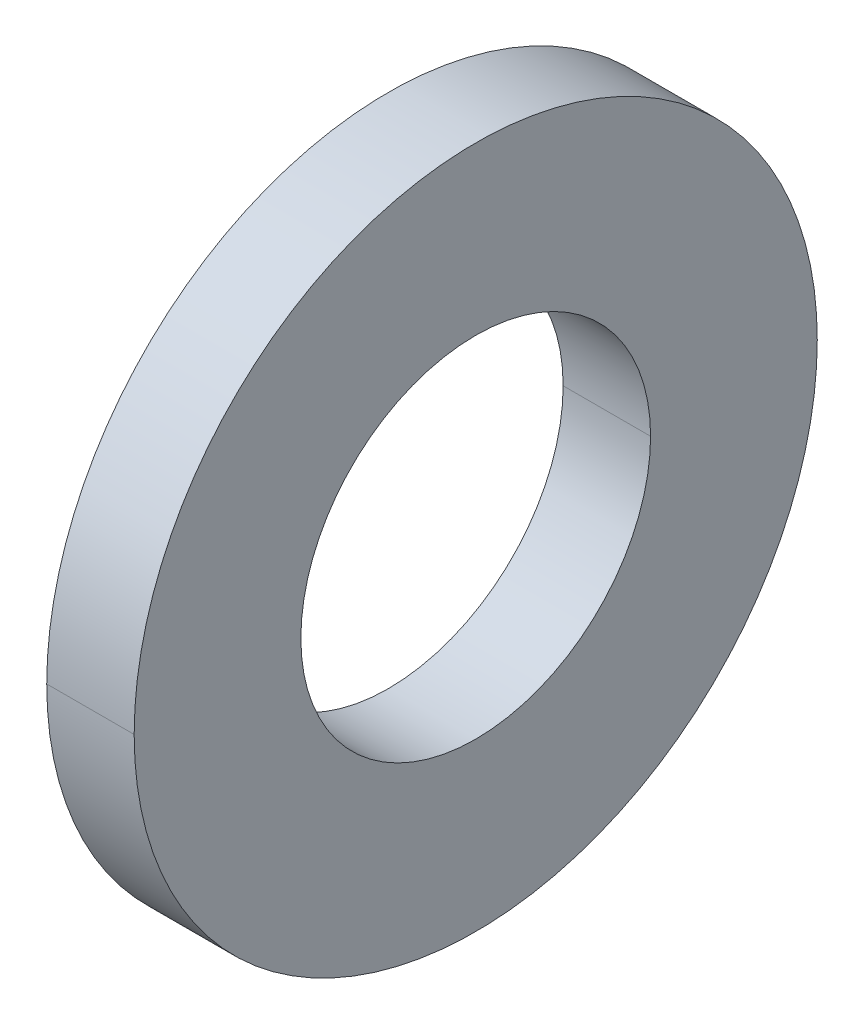
ISO-10303-21;
HEADER;
FILE_DESCRIPTION(('STEP AP214'),'2;1');
FILE_NAME('part.step','',(''),(''),'','','');
FILE_SCHEMA(('AUTOMOTIVE_DESIGN { 1 0 10303 214 1 1 1 1 }'));
ENDSEC;
DATA;
#1=APPLICATION_CONTEXT('core data for automotive mechanical design processes');
#2=APPLICATION_PROTOCOL_DEFINITION('international standard','automotive_design',2000,#1);
#3=PRODUCT_CONTEXT('',#1,'mechanical');
#4=PRODUCT('Part','Part','',(#3));
#5=PRODUCT_RELATED_PRODUCT_CATEGORY('part','',(#4));
#6=PRODUCT_DEFINITION_FORMATION('','',#4);
#7=PRODUCT_DEFINITION_CONTEXT('part definition',#1,'design');
#8=PRODUCT_DEFINITION('design','',#6,#7);
#9=PRODUCT_DEFINITION_SHAPE('','',#8);
#10=(LENGTH_UNIT() NAMED_UNIT(*) SI_UNIT(.MILLI.,.METRE.));
#11=(NAMED_UNIT(*) PLANE_ANGLE_UNIT() SI_UNIT($,.RADIAN.));
#12=(NAMED_UNIT(*) SI_UNIT($,.STERADIAN.) SOLID_ANGLE_UNIT());
#13=UNCERTAINTY_MEASURE_WITH_UNIT(LENGTH_MEASURE(1.E-05),#10,'distance_accuracy_value','');
#14=(GEOMETRIC_REPRESENTATION_CONTEXT(3) GLOBAL_UNCERTAINTY_ASSIGNED_CONTEXT((#13)) GLOBAL_UNIT_ASSIGNED_CONTEXT((#10,
#11,#12)) REPRESENTATION_CONTEXT('',''));
#15=CARTESIAN_POINT('',(0.,0.,0.));
#16=DIRECTION('',(0.,0.,1.));
#17=DIRECTION('',(1.,0.,0.));
#18=AXIS2_PLACEMENT_3D('',#15,#16,#17);
#19=CARTESIAN_POINT('',(0.8,0.,0.));
#20=DIRECTION('',(-1.,0.,0.));
#21=DIRECTION('',(0.,1.,0.));
#22=AXIS2_PLACEMENT_3D('',#19,#20,#21);
#23=CYLINDRICAL_SURFACE('',#22,6.25);
#24=CARTESIAN_POINT('',(-0.8,0.,0.));
#25=DIRECTION('',(1.,0.,0.));
#26=DIRECTION('',(0.,0.,-1.));
#27=AXIS2_PLACEMENT_3D('',#24,#25,#26);
#28=CIRCLE('',#27,6.25);
#29=CARTESIAN_POINT('',(-0.8,0.,6.25));
#30=VERTEX_POINT('',#29);
#31=CARTESIAN_POINT('',(-0.8,0.,-6.25));
#32=VERTEX_POINT('',#31);
#33=EDGE_CURVE('E10',#30,#32,#28,.T.);
#34=ORIENTED_EDGE('',*,*,#33,.T.);
#35=CARTESIAN_POINT('',(0.8,0.,-6.25));
#36=DIRECTION('',(-1.,0.,0.));
#37=VECTOR('',#36,1.);
#38=LINE('',#35,#37);
#39=CARTESIAN_POINT('',(0.8,0.,-6.25));
#40=VERTEX_POINT('',#39);
#41=EDGE_CURVE('E25',#40,#32,#38,.T.);
#42=ORIENTED_EDGE('',*,*,#41,.F.);
#43=CARTESIAN_POINT('',(0.8,0.,0.));
#44=DIRECTION('',(1.,0.,0.));
#45=DIRECTION('',(0.,0.,-1.));
#46=AXIS2_PLACEMENT_3D('',#43,#44,#45);
#47=CIRCLE('',#46,6.25);
#48=CARTESIAN_POINT('',(0.8,0.,6.25));
#49=VERTEX_POINT('',#48);
#50=EDGE_CURVE('E160',#49,#40,#47,.T.);
#51=ORIENTED_EDGE('',*,*,#50,.F.);
#52=CARTESIAN_POINT('',(0.8,0.,6.25));
#53=DIRECTION('',(-1.,0.,0.));
#54=VECTOR('',#53,1.);
#55=LINE('',#52,#54);
#56=EDGE_CURVE('E148',#49,#30,#55,.T.);
#57=ORIENTED_EDGE('',*,*,#56,.T.);
#58=EDGE_LOOP('',(#34,#42,#51,#57));
#59=FACE_BOUND('',#58,.T.);
#60=ADVANCED_FACE('F16',(#59),#23,.T.);
#61=CARTESIAN_POINT('',(0.8,0.,0.));
#62=DIRECTION('',(-1.,0.,0.));
#63=DIRECTION('',(0.,-1.,0.));
#64=AXIS2_PLACEMENT_3D('',#61,#62,#63);
#65=CYLINDRICAL_SURFACE('',#64,6.25);
#66=CARTESIAN_POINT('',(0.8,0.,0.));
#67=DIRECTION('',(1.,0.,0.));
#68=DIRECTION('',(0.,0.,-1.));
#69=AXIS2_PLACEMENT_3D('',#66,#67,#68);
#70=CIRCLE('',#69,6.25);
#71=EDGE_CURVE('E145',#40,#49,#70,.T.);
#72=ORIENTED_EDGE('',*,*,#71,.F.);
#73=ORIENTED_EDGE('',*,*,#41,.T.);
#74=CARTESIAN_POINT('',(-0.8,0.,0.));
#75=DIRECTION('',(1.,0.,0.));
#76=DIRECTION('',(0.,0.,-1.));
#77=AXIS2_PLACEMENT_3D('',#74,#75,#76);
#78=CIRCLE('',#77,6.25);
#79=EDGE_CURVE('E113',#32,#30,#78,.T.);
#80=ORIENTED_EDGE('',*,*,#79,.T.);
#81=ORIENTED_EDGE('',*,*,#56,.F.);
#82=EDGE_LOOP('',(#72,#73,#80,#81));
#83=FACE_BOUND('',#82,.T.);
#84=ADVANCED_FACE('F121',(#83),#65,.T.);
#85=CARTESIAN_POINT('',(-0.8,6.25,0.));
#86=DIRECTION('',(-1.,0.,0.));
#87=DIRECTION('',(0.,0.,1.));
#88=AXIS2_PLACEMENT_3D('',#85,#86,#87);
#89=PLANE('',#88);
#90=CARTESIAN_POINT('',(-0.8,0.,0.));
#91=DIRECTION('',(1.,0.,0.));
#92=DIRECTION('',(0.,0.,-1.));
#93=AXIS2_PLACEMENT_3D('',#90,#91,#92);
#94=CIRCLE('',#93,3.2);
#95=CARTESIAN_POINT('',(-0.8,0.,-3.2));
#96=VERTEX_POINT('',#95);
#97=CARTESIAN_POINT('',(-0.8,0.,3.2));
#98=VERTEX_POINT('',#97);
#99=EDGE_CURVE('E72',#96,#98,#94,.T.);
#100=ORIENTED_EDGE('',*,*,#99,.T.);
#101=CARTESIAN_POINT('',(-0.8,0.,0.));
#102=DIRECTION('',(1.,0.,0.));
#103=DIRECTION('',(0.,0.,-1.));
#104=AXIS2_PLACEMENT_3D('',#101,#102,#103);
#105=CIRCLE('',#104,3.2);
#106=EDGE_CURVE('E108',#98,#96,#105,.T.);
#107=ORIENTED_EDGE('',*,*,#106,.T.);
#108=EDGE_LOOP('',(#100,#107));
#109=FACE_BOUND('',#108,.T.);
#110=ORIENTED_EDGE('',*,*,#79,.F.);
#111=ORIENTED_EDGE('',*,*,#33,.F.);
#112=EDGE_LOOP('',(#110,#111));
#113=FACE_BOUND('',#112,.T.);
#114=ADVANCED_FACE('F93',(#109,#113),#89,.T.);
#115=CARTESIAN_POINT('',(0.8,0.,0.));
#116=DIRECTION('',(-1.,0.,0.));
#117=DIRECTION('',(0.,1.,0.));
#118=AXIS2_PLACEMENT_3D('',#115,#116,#117);
#119=CYLINDRICAL_SURFACE('',#118,3.2);
#120=ORIENTED_EDGE('',*,*,#106,.F.);
#121=CARTESIAN_POINT('',(0.8,0.,3.2));
#122=DIRECTION('',(-1.,0.,0.));
#123=VECTOR('',#122,1.);
#124=LINE('',#121,#123);
#125=CARTESIAN_POINT('',(0.8,0.,3.2));
#126=VERTEX_POINT('',#125);
#127=EDGE_CURVE('E62',#126,#98,#124,.T.);
#128=ORIENTED_EDGE('',*,*,#127,.F.);
#129=CARTESIAN_POINT('',(0.8,0.,0.));
#130=DIRECTION('',(1.,0.,0.));
#131=DIRECTION('',(0.,0.,-1.));
#132=AXIS2_PLACEMENT_3D('',#129,#130,#131);
#133=CIRCLE('',#132,3.2);
#134=CARTESIAN_POINT('',(0.8,0.,-3.2));
#135=VERTEX_POINT('',#134);
#136=EDGE_CURVE('E54',#126,#135,#133,.T.);
#137=ORIENTED_EDGE('',*,*,#136,.T.);
#138=CARTESIAN_POINT('',(0.8,0.,-3.2));
#139=DIRECTION('',(-1.,0.,0.));
#140=VECTOR('',#139,1.);
#141=LINE('',#138,#140);
#142=EDGE_CURVE('E58',#135,#96,#141,.T.);
#143=ORIENTED_EDGE('',*,*,#142,.T.);
#144=EDGE_LOOP('',(#120,#128,#137,#143));
#145=FACE_BOUND('',#144,.T.);
#146=ADVANCED_FACE('F57',(#145),#119,.F.);
#147=CARTESIAN_POINT('',(0.8,0.,0.));
#148=DIRECTION('',(-1.,0.,0.));
#149=DIRECTION('',(0.,-1.,0.));
#150=AXIS2_PLACEMENT_3D('',#147,#148,#149);
#151=CYLINDRICAL_SURFACE('',#150,3.2);
#152=CARTESIAN_POINT('',(0.8,0.,0.));
#153=DIRECTION('',(1.,0.,0.));
#154=DIRECTION('',(0.,0.,-1.));
#155=AXIS2_PLACEMENT_3D('',#152,#153,#154);
#156=CIRCLE('',#155,3.2);
#157=EDGE_CURVE('E71',#135,#126,#156,.T.);
#158=ORIENTED_EDGE('',*,*,#157,.T.);
#159=ORIENTED_EDGE('',*,*,#127,.T.);
#160=ORIENTED_EDGE('',*,*,#99,.F.);
#161=ORIENTED_EDGE('',*,*,#142,.F.);
#162=EDGE_LOOP('',(#158,#159,#160,#161));
#163=FACE_BOUND('',#162,.T.);
#164=ADVANCED_FACE('F70',(#163),#151,.F.);
#165=CARTESIAN_POINT('',(0.8,3.2,0.));
#166=DIRECTION('',(1.,0.,0.));
#167=DIRECTION('',(0.,0.,-1.));
#168=AXIS2_PLACEMENT_3D('',#165,#166,#167);
#169=PLANE('',#168);
#170=ORIENTED_EDGE('',*,*,#71,.T.);
#171=ORIENTED_EDGE('',*,*,#50,.T.);
#172=EDGE_LOOP('',(#170,#171));
#173=FACE_BOUND('',#172,.T.);
#174=ORIENTED_EDGE('',*,*,#157,.F.);
#175=ORIENTED_EDGE('',*,*,#136,.F.);
#176=EDGE_LOOP('',(#174,#175));
#177=FACE_BOUND('',#176,.T.);
#178=ADVANCED_FACE('F75',(#173,#177),#169,.T.);
#179=CLOSED_SHELL('',(#60,#84,#114,#146,#164,#178));
#180=MANIFOLD_SOLID_BREP('B1',#179);
#181=ADVANCED_BREP_SHAPE_REPRESENTATION('',(#18,#180),#14);
#182=SHAPE_DEFINITION_REPRESENTATION(#9,#181);
ENDSEC;
END-ISO-10303-21;
